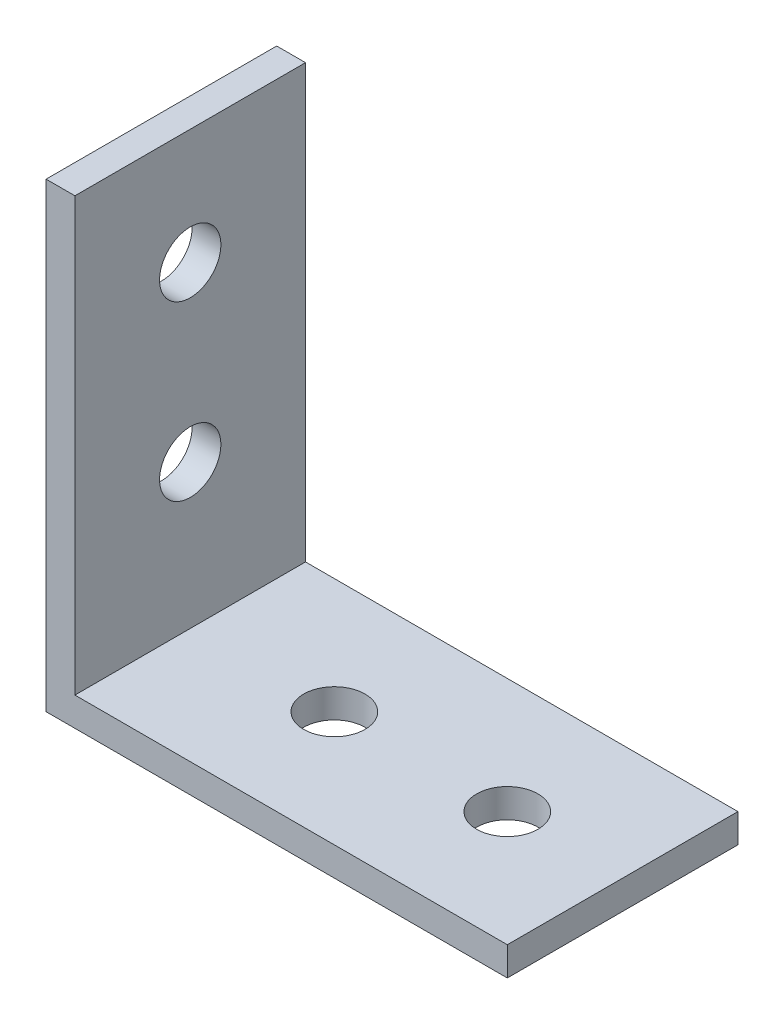
ISO-10303-21;
HEADER;
FILE_DESCRIPTION(('STEP AP214'),'2;1');
FILE_NAME('part.step','',(''),(''),'','','');
FILE_SCHEMA(('AUTOMOTIVE_DESIGN { 1 0 10303 214 1 1 1 1 }'));
ENDSEC;
DATA;
#1=APPLICATION_CONTEXT('core data for automotive mechanical design processes');
#2=APPLICATION_PROTOCOL_DEFINITION('international standard','automotive_design',2000,#1);
#3=PRODUCT_CONTEXT('',#1,'mechanical');
#4=PRODUCT('Part','Part','',(#3));
#5=PRODUCT_RELATED_PRODUCT_CATEGORY('part','',(#4));
#6=PRODUCT_DEFINITION_FORMATION('','',#4);
#7=PRODUCT_DEFINITION_CONTEXT('part definition',#1,'design');
#8=PRODUCT_DEFINITION('design','',#6,#7);
#9=PRODUCT_DEFINITION_SHAPE('','',#8);
#10=(LENGTH_UNIT() NAMED_UNIT(*) SI_UNIT(.MILLI.,.METRE.));
#11=(NAMED_UNIT(*) PLANE_ANGLE_UNIT() SI_UNIT($,.RADIAN.));
#12=(NAMED_UNIT(*) SI_UNIT($,.STERADIAN.) SOLID_ANGLE_UNIT());
#13=UNCERTAINTY_MEASURE_WITH_UNIT(LENGTH_MEASURE(1.E-05),#10,'distance_accuracy_value','');
#14=(GEOMETRIC_REPRESENTATION_CONTEXT(3) GLOBAL_UNCERTAINTY_ASSIGNED_CONTEXT((#13)) GLOBAL_UNIT_ASSIGNED_CONTEXT((#10,
#11,#12)) REPRESENTATION_CONTEXT('',''));
#15=CARTESIAN_POINT('',(0.,0.,0.));
#16=DIRECTION('',(0.,0.,1.));
#17=DIRECTION('',(1.,0.,0.));
#18=AXIS2_PLACEMENT_3D('',#15,#16,#17);
#19=CARTESIAN_POINT('',(3.175,-12.7,12.7));
#20=DIRECTION('',(1.,0.,0.));
#21=DIRECTION('',(0.,0.,-1.));
#22=AXIS2_PLACEMENT_3D('',#19,#20,#21);
#23=CYLINDRICAL_SURFACE('',#22,3.3782);
#24=CARTESIAN_POINT('',(0.,-12.7,12.7));
#25=DIRECTION('',(1.,0.,0.));
#26=DIRECTION('',(0.,0.,-1.));
#27=AXIS2_PLACEMENT_3D('',#24,#25,#26);
#28=CIRCLE('',#27,3.3782);
#29=CARTESIAN_POINT('',(0.,-12.7,9.3218));
#30=VERTEX_POINT('',#29);
#31=EDGE_CURVE('E113',#30,#30,#28,.F.);
#32=ORIENTED_EDGE('',*,*,#31,.T.);
#33=EDGE_LOOP('',(#32));
#34=FACE_BOUND('',#33,.T.);
#35=CARTESIAN_POINT('',(3.175,-12.7,12.7));
#36=DIRECTION('',(1.,0.,0.));
#37=DIRECTION('',(0.,0.,-1.));
#38=AXIS2_PLACEMENT_3D('',#35,#36,#37);
#39=CIRCLE('',#38,3.3782);
#40=CARTESIAN_POINT('',(3.175,-12.7,9.3218));
#41=VERTEX_POINT('',#40);
#42=EDGE_CURVE('E20',#41,#41,#39,.T.);
#43=ORIENTED_EDGE('',*,*,#42,.T.);
#44=EDGE_LOOP('',(#43));
#45=FACE_BOUND('',#44,.T.);
#46=ADVANCED_FACE('F17',(#34,#45),#23,.F.);
#47=CARTESIAN_POINT('',(3.175,-31.75,12.7));
#48=DIRECTION('',(1.,0.,0.));
#49=DIRECTION('',(0.,0.,-1.));
#50=AXIS2_PLACEMENT_3D('',#47,#48,#49);
#51=CYLINDRICAL_SURFACE('',#50,3.3782);
#52=CARTESIAN_POINT('',(0.,-31.75,12.7));
#53=DIRECTION('',(1.,0.,0.));
#54=DIRECTION('',(0.,0.,-1.));
#55=AXIS2_PLACEMENT_3D('',#52,#53,#54);
#56=CIRCLE('',#55,3.3782);
#57=CARTESIAN_POINT('',(0.,-31.75,9.3218));
#58=VERTEX_POINT('',#57);
#59=EDGE_CURVE('E97',#58,#58,#56,.F.);
#60=ORIENTED_EDGE('',*,*,#59,.T.);
#61=EDGE_LOOP('',(#60));
#62=FACE_BOUND('',#61,.T.);
#63=CARTESIAN_POINT('',(3.175,-31.75,12.7));
#64=DIRECTION('',(1.,0.,0.));
#65=DIRECTION('',(0.,0.,-1.));
#66=AXIS2_PLACEMENT_3D('',#63,#64,#65);
#67=CIRCLE('',#66,3.3782);
#68=CARTESIAN_POINT('',(3.175,-31.75,9.3218));
#69=VERTEX_POINT('',#68);
#70=EDGE_CURVE('E102',#69,#69,#67,.T.);
#71=ORIENTED_EDGE('',*,*,#70,.T.);
#72=EDGE_LOOP('',(#71));
#73=FACE_BOUND('',#72,.T.);
#74=ADVANCED_FACE('F138',(#62,#73),#51,.F.);
#75=CARTESIAN_POINT('',(0.,0.,25.4));
#76=DIRECTION('',(0.,-1.,0.));
#77=DIRECTION('',(0.,0.,-1.));
#78=AXIS2_PLACEMENT_3D('',#75,#76,#77);
#79=PLANE('',#78);
#80=DIRECTION('',(0.,0.,1.));
#81=VECTOR('',#80,1.);
#82=CARTESIAN_POINT('',(0.,0.,25.4));
#83=LINE('',#82,#81);
#84=CARTESIAN_POINT('',(0.,0.,0.));
#85=VERTEX_POINT('',#84);
#86=CARTESIAN_POINT('',(0.,0.,25.4));
#87=VERTEX_POINT('',#86);
#88=EDGE_CURVE('E95',#85,#87,#83,.T.);
#89=ORIENTED_EDGE('',*,*,#88,.T.);
#90=DIRECTION('',(-1.,0.,0.));
#91=VECTOR('',#90,1.);
#92=CARTESIAN_POINT('',(0.,0.,25.4));
#93=LINE('',#92,#91);
#94=CARTESIAN_POINT('',(3.175,0.,25.4));
#95=VERTEX_POINT('',#94);
#96=EDGE_CURVE('E279',#87,#95,#93,.F.);
#97=ORIENTED_EDGE('',*,*,#96,.T.);
#98=DIRECTION('',(0.,0.,1.));
#99=VECTOR('',#98,1.);
#100=CARTESIAN_POINT('',(3.175,0.,25.4));
#101=LINE('',#100,#99);
#102=CARTESIAN_POINT('',(3.175,0.,0.));
#103=VERTEX_POINT('',#102);
#104=EDGE_CURVE('E67',#95,#103,#101,.F.);
#105=ORIENTED_EDGE('',*,*,#104,.T.);
#106=DIRECTION('',(-1.,0.,0.));
#107=VECTOR('',#106,1.);
#108=CARTESIAN_POINT('',(0.,0.,0.));
#109=LINE('',#108,#107);
#110=EDGE_CURVE('E274',#85,#103,#109,.F.);
#111=ORIENTED_EDGE('',*,*,#110,.F.);
#112=EDGE_LOOP('',(#89,#97,#105,#111));
#113=FACE_BOUND('',#112,.T.);
#114=ADVANCED_FACE('F128',(#113),#79,.F.);
#115=CARTESIAN_POINT('',(3.175,0.,25.4));
#116=DIRECTION('',(-1.,0.,0.));
#117=DIRECTION('',(0.,-1.,0.));
#118=AXIS2_PLACEMENT_3D('',#115,#116,#117);
#119=PLANE('',#118);
#120=ORIENTED_EDGE('',*,*,#104,.F.);
#121=DIRECTION('',(0.,1.,0.));
#122=VECTOR('',#121,1.);
#123=CARTESIAN_POINT('',(3.175,0.,25.4));
#124=LINE('',#123,#122);
#125=CARTESIAN_POINT('',(3.175,-47.625,25.4));
#126=VERTEX_POINT('',#125);
#127=EDGE_CURVE('E87',#95,#126,#124,.F.);
#128=ORIENTED_EDGE('',*,*,#127,.T.);
#129=DIRECTION('',(0.,0.,-1.));
#130=VECTOR('',#129,1.);
#131=CARTESIAN_POINT('',(3.175,-47.625,25.4));
#132=LINE('',#131,#130);
#133=CARTESIAN_POINT('',(3.175,-47.625,0.));
#134=VERTEX_POINT('',#133);
#135=EDGE_CURVE('E73',#126,#134,#132,.T.);
#136=ORIENTED_EDGE('',*,*,#135,.T.);
#137=DIRECTION('',(0.,1.,0.));
#138=VECTOR('',#137,1.);
#139=CARTESIAN_POINT('',(3.175,0.,0.));
#140=LINE('',#139,#138);
#141=EDGE_CURVE('E272',#103,#134,#140,.F.);
#142=ORIENTED_EDGE('',*,*,#141,.F.);
#143=EDGE_LOOP('',(#120,#128,#136,#142));
#144=FACE_BOUND('',#143,.T.);
#145=ORIENTED_EDGE('',*,*,#70,.F.);
#146=EDGE_LOOP('',(#145));
#147=FACE_BOUND('',#146,.T.);
#148=ORIENTED_EDGE('',*,*,#42,.F.);
#149=EDGE_LOOP('',(#148));
#150=FACE_BOUND('',#149,.T.);
#151=ADVANCED_FACE('F93',(#144,#147,#150),#119,.F.);
#152=CARTESIAN_POINT('',(3.175,-47.625,25.4));
#153=DIRECTION('',(0.,-1.,0.));
#154=DIRECTION('',(0.,0.,-1.));
#155=AXIS2_PLACEMENT_3D('',#152,#153,#154);
#156=PLANE('',#155);
#157=CARTESIAN_POINT('',(38.1,-47.625,12.7));
#158=DIRECTION('',(0.,1.,0.));
#159=DIRECTION('',(0.,0.,1.));
#160=AXIS2_PLACEMENT_3D('',#157,#158,#159);
#161=CIRCLE('',#160,3.3782);
#162=CARTESIAN_POINT('',(38.1,-47.625,16.0782));
#163=VERTEX_POINT('',#162);
#164=EDGE_CURVE('E81',#163,#163,#161,.F.);
#165=ORIENTED_EDGE('',*,*,#164,.T.);
#166=EDGE_LOOP('',(#165));
#167=FACE_BOUND('',#166,.T.);
#168=ORIENTED_EDGE('',*,*,#135,.F.);
#169=DIRECTION('',(-1.,0.,0.));
#170=VECTOR('',#169,1.);
#171=CARTESIAN_POINT('',(0.,-47.625,25.4));
#172=LINE('',#171,#170);
#173=CARTESIAN_POINT('',(50.8,-47.625,25.4));
#174=VERTEX_POINT('',#173);
#175=EDGE_CURVE('E78',#126,#174,#172,.F.);
#176=ORIENTED_EDGE('',*,*,#175,.T.);
#177=DIRECTION('',(0.,0.,1.));
#178=VECTOR('',#177,1.);
#179=CARTESIAN_POINT('',(50.8,-47.625,25.4));
#180=LINE('',#179,#178);
#181=CARTESIAN_POINT('',(50.8,-47.625,0.));
#182=VERTEX_POINT('',#181);
#183=EDGE_CURVE('E276',#174,#182,#180,.F.);
#184=ORIENTED_EDGE('',*,*,#183,.T.);
#185=DIRECTION('',(-1.,0.,0.));
#186=VECTOR('',#185,1.);
#187=CARTESIAN_POINT('',(0.,-47.625,0.));
#188=LINE('',#187,#186);
#189=EDGE_CURVE('E80',#134,#182,#188,.F.);
#190=ORIENTED_EDGE('',*,*,#189,.F.);
#191=EDGE_LOOP('',(#168,#176,#184,#190));
#192=FACE_BOUND('',#191,.T.);
#193=CARTESIAN_POINT('',(19.05,-47.625,12.7));
#194=DIRECTION('',(0.,1.,0.));
#195=DIRECTION('',(0.,0.,1.));
#196=AXIS2_PLACEMENT_3D('',#193,#194,#195);
#197=CIRCLE('',#196,3.3782);
#198=CARTESIAN_POINT('',(19.05,-47.625,16.0782));
#199=VERTEX_POINT('',#198);
#200=EDGE_CURVE('E116',#199,#199,#197,.F.);
#201=ORIENTED_EDGE('',*,*,#200,.T.);
#202=EDGE_LOOP('',(#201));
#203=FACE_BOUND('',#202,.T.);
#204=ADVANCED_FACE('F75',(#167,#192,#203),#156,.F.);
#205=CARTESIAN_POINT('',(38.1,-47.625,12.7));
#206=DIRECTION('',(0.,1.,0.));
#207=DIRECTION('',(0.,0.,1.));
#208=AXIS2_PLACEMENT_3D('',#205,#206,#207);
#209=CYLINDRICAL_SURFACE('',#208,3.3782);
#210=CARTESIAN_POINT('',(38.1,-50.8,12.7));
#211=DIRECTION('',(0.,1.,0.));
#212=DIRECTION('',(0.,0.,1.));
#213=AXIS2_PLACEMENT_3D('',#210,#211,#212);
#214=CIRCLE('',#213,3.3782);
#215=CARTESIAN_POINT('',(38.1,-50.8,16.0782));
#216=VERTEX_POINT('',#215);
#217=EDGE_CURVE('E107',#216,#216,#214,.F.);
#218=ORIENTED_EDGE('',*,*,#217,.T.);
#219=EDGE_LOOP('',(#218));
#220=FACE_BOUND('',#219,.T.);
#221=ORIENTED_EDGE('',*,*,#164,.F.);
#222=EDGE_LOOP('',(#221));
#223=FACE_BOUND('',#222,.T.);
#224=ADVANCED_FACE('F135',(#220,#223),#209,.F.);
#225=CARTESIAN_POINT('',(19.05,-47.625,12.7));
#226=DIRECTION('',(0.,1.,0.));
#227=DIRECTION('',(0.,0.,1.));
#228=AXIS2_PLACEMENT_3D('',#225,#226,#227);
#229=CYLINDRICAL_SURFACE('',#228,3.3782);
#230=CARTESIAN_POINT('',(19.05,-50.8,12.7));
#231=DIRECTION('',(0.,1.,0.));
#232=DIRECTION('',(0.,0.,1.));
#233=AXIS2_PLACEMENT_3D('',#230,#231,#232);
#234=CIRCLE('',#233,3.3782);
#235=CARTESIAN_POINT('',(19.05,-50.8,16.0782));
#236=VERTEX_POINT('',#235);
#237=EDGE_CURVE('E103',#236,#236,#234,.F.);
#238=ORIENTED_EDGE('',*,*,#237,.T.);
#239=EDGE_LOOP('',(#238));
#240=FACE_BOUND('',#239,.T.);
#241=ORIENTED_EDGE('',*,*,#200,.F.);
#242=EDGE_LOOP('',(#241));
#243=FACE_BOUND('',#242,.T.);
#244=ADVANCED_FACE('F162',(#240,#243),#229,.F.);
#245=CARTESIAN_POINT('',(0.,0.,25.4));
#246=DIRECTION('',(1.,0.,0.));
#247=DIRECTION('',(0.,1.,0.));
#248=AXIS2_PLACEMENT_3D('',#245,#246,#247);
#249=PLANE('',#248);
#250=DIRECTION('',(0.,0.,1.));
#251=VECTOR('',#250,1.);
#252=CARTESIAN_POINT('',(0.,-50.8,25.4));
#253=LINE('',#252,#251);
#254=CARTESIAN_POINT('',(0.,-50.8,0.));
#255=VERTEX_POINT('',#254);
#256=CARTESIAN_POINT('',(0.,-50.8,25.4));
#257=VERTEX_POINT('',#256);
#258=EDGE_CURVE('E106',#255,#257,#253,.T.);
#259=ORIENTED_EDGE('',*,*,#258,.T.);
#260=DIRECTION('',(0.,1.,0.));
#261=VECTOR('',#260,1.);
#262=CARTESIAN_POINT('',(0.,0.,25.4));
#263=LINE('',#262,#261);
#264=EDGE_CURVE('E91',#257,#87,#263,.T.);
#265=ORIENTED_EDGE('',*,*,#264,.T.);
#266=ORIENTED_EDGE('',*,*,#88,.F.);
#267=DIRECTION('',(0.,1.,0.));
#268=VECTOR('',#267,1.);
#269=CARTESIAN_POINT('',(0.,0.,0.));
#270=LINE('',#269,#268);
#271=EDGE_CURVE('E110',#255,#85,#270,.T.);
#272=ORIENTED_EDGE('',*,*,#271,.F.);
#273=EDGE_LOOP('',(#259,#265,#266,#272));
#274=FACE_BOUND('',#273,.T.);
#275=ORIENTED_EDGE('',*,*,#59,.F.);
#276=EDGE_LOOP('',(#275));
#277=FACE_BOUND('',#276,.T.);
#278=ORIENTED_EDGE('',*,*,#31,.F.);
#279=EDGE_LOOP('',(#278));
#280=FACE_BOUND('',#279,.T.);
#281=ADVANCED_FACE('F159',(#274,#277,#280),#249,.F.);
#282=CARTESIAN_POINT('',(0.,0.,25.4));
#283=DIRECTION('',(0.,0.,-1.));
#284=DIRECTION('',(-1.,0.,0.));
#285=AXIS2_PLACEMENT_3D('',#282,#283,#284);
#286=PLANE('',#285);
#287=ORIENTED_EDGE('',*,*,#264,.F.);
#288=DIRECTION('',(1.,0.,0.));
#289=VECTOR('',#288,1.);
#290=CARTESIAN_POINT('',(0.,-50.8,25.4));
#291=LINE('',#290,#289);
#292=CARTESIAN_POINT('',(50.8,-50.8,25.4));
#293=VERTEX_POINT('',#292);
#294=EDGE_CURVE('E264',#257,#293,#291,.T.);
#295=ORIENTED_EDGE('',*,*,#294,.T.);
#296=DIRECTION('',(0.,1.,0.));
#297=VECTOR('',#296,1.);
#298=CARTESIAN_POINT('',(50.8,-50.8,25.4));
#299=LINE('',#298,#297);
#300=EDGE_CURVE('E90',#293,#174,#299,.T.);
#301=ORIENTED_EDGE('',*,*,#300,.T.);
#302=ORIENTED_EDGE('',*,*,#175,.F.);
#303=ORIENTED_EDGE('',*,*,#127,.F.);
#304=ORIENTED_EDGE('',*,*,#96,.F.);
#305=EDGE_LOOP('',(#287,#295,#301,#302,#303,#304));
#306=FACE_BOUND('',#305,.T.);
#307=ADVANCED_FACE('F85',(#306),#286,.F.);
#308=CARTESIAN_POINT('',(50.8,-50.8,25.4));
#309=DIRECTION('',(-1.,0.,0.));
#310=DIRECTION('',(0.,0.,1.));
#311=AXIS2_PLACEMENT_3D('',#308,#309,#310);
#312=PLANE('',#311);
#313=ORIENTED_EDGE('',*,*,#183,.F.);
#314=ORIENTED_EDGE('',*,*,#300,.F.);
#315=DIRECTION('',(0.,0.,1.));
#316=VECTOR('',#315,1.);
#317=CARTESIAN_POINT('',(50.8,-50.8,25.4));
#318=LINE('',#317,#316);
#319=CARTESIAN_POINT('',(50.8,-50.8,0.));
#320=VERTEX_POINT('',#319);
#321=EDGE_CURVE('E26',#293,#320,#318,.F.);
#322=ORIENTED_EDGE('',*,*,#321,.T.);
#323=DIRECTION('',(0.,1.,0.));
#324=VECTOR('',#323,1.);
#325=CARTESIAN_POINT('',(50.8,0.,0.));
#326=LINE('',#325,#324);
#327=EDGE_CURVE('E34',#182,#320,#326,.F.);
#328=ORIENTED_EDGE('',*,*,#327,.F.);
#329=EDGE_LOOP('',(#313,#314,#322,#328));
#330=FACE_BOUND('',#329,.T.);
#331=ADVANCED_FACE('F149',(#330),#312,.F.);
#332=CARTESIAN_POINT('',(0.,0.,0.));
#333=DIRECTION('',(0.,0.,-1.));
#334=DIRECTION('',(-1.,0.,0.));
#335=AXIS2_PLACEMENT_3D('',#332,#333,#334);
#336=PLANE('',#335);
#337=DIRECTION('',(1.,0.,0.));
#338=VECTOR('',#337,1.);
#339=CARTESIAN_POINT('',(0.,-50.8,0.));
#340=LINE('',#339,#338);
#341=EDGE_CURVE('E11',#320,#255,#340,.F.);
#342=ORIENTED_EDGE('',*,*,#341,.T.);
#343=ORIENTED_EDGE('',*,*,#271,.T.);
#344=ORIENTED_EDGE('',*,*,#110,.T.);
#345=ORIENTED_EDGE('',*,*,#141,.T.);
#346=ORIENTED_EDGE('',*,*,#189,.T.);
#347=ORIENTED_EDGE('',*,*,#327,.T.);
#348=EDGE_LOOP('',(#342,#343,#344,#345,#346,#347));
#349=FACE_BOUND('',#348,.T.);
#350=ADVANCED_FACE('F143',(#349),#336,.T.);
#351=CARTESIAN_POINT('',(0.,-50.8,25.4));
#352=DIRECTION('',(0.,1.,0.));
#353=DIRECTION('',(0.,0.,1.));
#354=AXIS2_PLACEMENT_3D('',#351,#352,#353);
#355=PLANE('',#354);
#356=ORIENTED_EDGE('',*,*,#321,.F.);
#357=ORIENTED_EDGE('',*,*,#294,.F.);
#358=ORIENTED_EDGE('',*,*,#258,.F.);
#359=ORIENTED_EDGE('',*,*,#341,.F.);
#360=EDGE_LOOP('',(#356,#357,#358,#359));
#361=FACE_BOUND('',#360,.T.);
#362=ORIENTED_EDGE('',*,*,#237,.F.);
#363=EDGE_LOOP('',(#362));
#364=FACE_BOUND('',#363,.T.);
#365=ORIENTED_EDGE('',*,*,#217,.F.);
#366=EDGE_LOOP('',(#365));
#367=FACE_BOUND('',#366,.T.);
#368=ADVANCED_FACE('F141',(#361,#364,#367),#355,.F.);
#369=CLOSED_SHELL('',(#46,#74,#114,#151,#204,#224,#244,#281,#307,#331,#350,#368));
#370=MANIFOLD_SOLID_BREP('B1',#369);
#371=ADVANCED_BREP_SHAPE_REPRESENTATION('',(#18,#370),#14);
#372=SHAPE_DEFINITION_REPRESENTATION(#9,#371);
ENDSEC;
END-ISO-10303-21;
